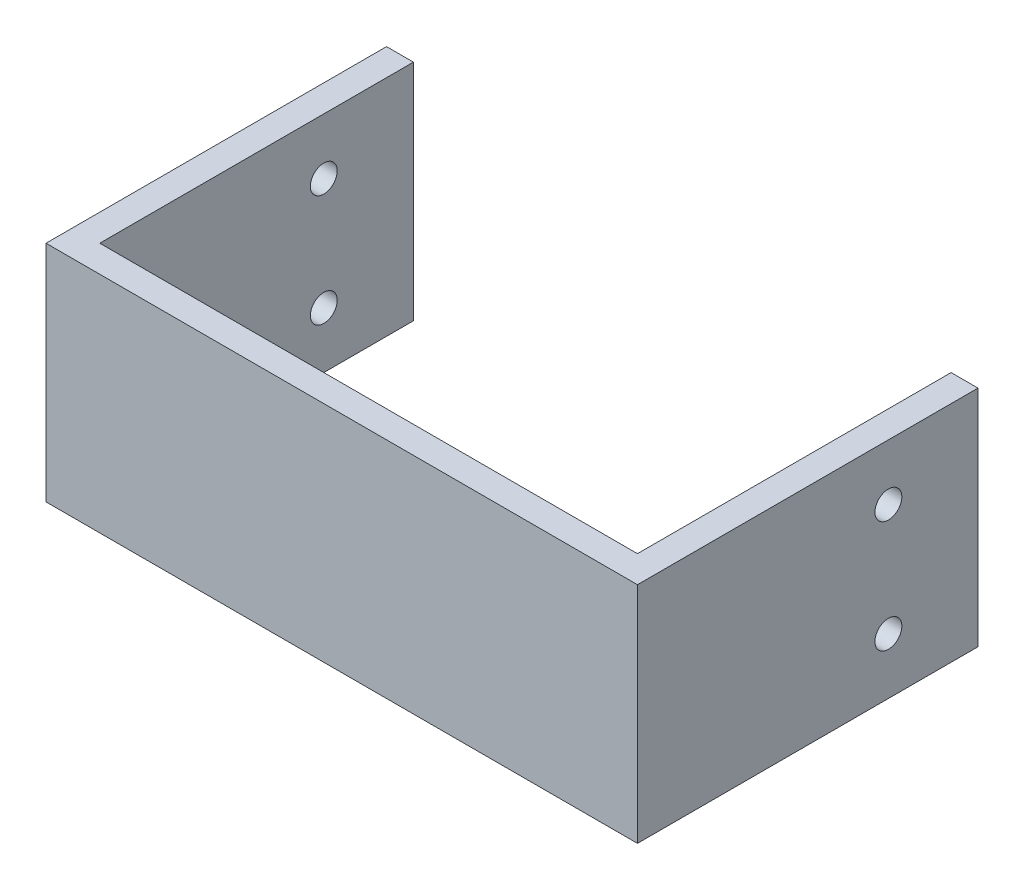
ISO-10303-21;
HEADER;
FILE_DESCRIPTION(('STEP AP214'),'2;1');
FILE_NAME('part.step','',(''),(''),'','','');
FILE_SCHEMA(('AUTOMOTIVE_DESIGN { 1 0 10303 214 1 1 1 1 }'));
ENDSEC;
DATA;
#1=APPLICATION_CONTEXT('core data for automotive mechanical design processes');
#2=APPLICATION_PROTOCOL_DEFINITION('international standard','automotive_design',2000,#1);
#3=PRODUCT_CONTEXT('',#1,'mechanical');
#4=PRODUCT('Part','Part','',(#3));
#5=PRODUCT_RELATED_PRODUCT_CATEGORY('part','',(#4));
#6=PRODUCT_DEFINITION_FORMATION('','',#4);
#7=PRODUCT_DEFINITION_CONTEXT('part definition',#1,'design');
#8=PRODUCT_DEFINITION('design','',#6,#7);
#9=PRODUCT_DEFINITION_SHAPE('','',#8);
#10=(LENGTH_UNIT() NAMED_UNIT(*) SI_UNIT(.MILLI.,.METRE.));
#11=(NAMED_UNIT(*) PLANE_ANGLE_UNIT() SI_UNIT($,.RADIAN.));
#12=(NAMED_UNIT(*) SI_UNIT($,.STERADIAN.) SOLID_ANGLE_UNIT());
#13=UNCERTAINTY_MEASURE_WITH_UNIT(LENGTH_MEASURE(1.E-05),#10,'distance_accuracy_value','');
#14=(GEOMETRIC_REPRESENTATION_CONTEXT(3) GLOBAL_UNCERTAINTY_ASSIGNED_CONTEXT((#13)) GLOBAL_UNIT_ASSIGNED_CONTEXT((#10,
#11,#12)) REPRESENTATION_CONTEXT('',''));
#15=CARTESIAN_POINT('',(0.,0.,0.));
#16=DIRECTION('',(0.,0.,1.));
#17=DIRECTION('',(1.,0.,0.));
#18=AXIS2_PLACEMENT_3D('',#15,#16,#17);
#19=CARTESIAN_POINT('',(0.,0.,0.));
#20=DIRECTION('',(0.,0.,1.));
#21=DIRECTION('',(1.,0.,0.));
#22=AXIS2_PLACEMENT_3D('',#19,#20,#21);
#23=PLANE('',#22);
#24=DIRECTION('',(0.,-1.,0.));
#25=VECTOR('',#24,1.);
#26=CARTESIAN_POINT('',(3.,0.,0.));
#27=LINE('',#26,#25);
#28=CARTESIAN_POINT('',(3.,0.,0.));
#29=VERTEX_POINT('',#28);
#30=CARTESIAN_POINT('',(3.,-25.,0.));
#31=VERTEX_POINT('',#30);
#32=EDGE_CURVE('E111',#29,#31,#27,.T.);
#33=ORIENTED_EDGE('',*,*,#32,.F.);
#34=DIRECTION('',(-1.,0.,0.));
#35=VECTOR('',#34,1.);
#36=CARTESIAN_POINT('',(0.,0.,0.));
#37=LINE('',#36,#35);
#38=CARTESIAN_POINT('',(63.,0.,0.));
#39=VERTEX_POINT('',#38);
#40=EDGE_CURVE('E132',#39,#29,#37,.T.);
#41=ORIENTED_EDGE('',*,*,#40,.F.);
#42=DIRECTION('',(0.,1.,0.));
#43=VECTOR('',#42,1.);
#44=CARTESIAN_POINT('',(63.,0.,0.));
#45=LINE('',#44,#43);
#46=CARTESIAN_POINT('',(63.,-25.,0.));
#47=VERTEX_POINT('',#46);
#48=EDGE_CURVE('E120',#47,#39,#45,.T.);
#49=ORIENTED_EDGE('',*,*,#48,.F.);
#50=DIRECTION('',(1.,0.,0.));
#51=VECTOR('',#50,1.);
#52=CARTESIAN_POINT('',(0.,-25.,0.));
#53=LINE('',#52,#51);
#54=EDGE_CURVE('E59',#31,#47,#53,.T.);
#55=ORIENTED_EDGE('',*,*,#54,.F.);
#56=EDGE_LOOP('',(#33,#41,#49,#55));
#57=FACE_BOUND('',#56,.T.);
#58=ADVANCED_FACE('F41',(#57),#23,.F.);
#59=CARTESIAN_POINT('',(0.,0.,3.));
#60=DIRECTION('',(1.,0.,0.));
#61=DIRECTION('',(0.,1.,0.));
#62=AXIS2_PLACEMENT_3D('',#59,#60,#61);
#63=PLANE('',#62);
#64=CARTESIAN_POINT('',(0.,-6.25,-25.));
#65=DIRECTION('',(-1.,0.,0.));
#66=DIRECTION('',(0.,-1.,0.));
#67=AXIS2_PLACEMENT_3D('',#64,#65,#66);
#68=CIRCLE('',#67,1.5);
#69=CARTESIAN_POINT('',(0.,-7.75,-25.));
#70=VERTEX_POINT('',#69);
#71=EDGE_CURVE('E166',#70,#70,#68,.T.);
#72=ORIENTED_EDGE('',*,*,#71,.F.);
#73=EDGE_LOOP('',(#72));
#74=FACE_BOUND('',#73,.T.);
#75=CARTESIAN_POINT('',(0.,-18.75,-25.));
#76=DIRECTION('',(-1.,0.,0.));
#77=DIRECTION('',(0.,1.,0.));
#78=AXIS2_PLACEMENT_3D('',#75,#76,#77);
#79=CIRCLE('',#78,1.5);
#80=CARTESIAN_POINT('',(0.,-17.25,-25.));
#81=VERTEX_POINT('',#80);
#82=EDGE_CURVE('E173',#81,#81,#79,.T.);
#83=ORIENTED_EDGE('',*,*,#82,.F.);
#84=EDGE_LOOP('',(#83));
#85=FACE_BOUND('',#84,.T.);
#86=DIRECTION('',(0.,0.,-1.));
#87=VECTOR('',#86,1.);
#88=CARTESIAN_POINT('',(0.,0.,3.));
#89=LINE('',#88,#87);
#90=CARTESIAN_POINT('',(0.,0.,3.));
#91=VERTEX_POINT('',#90);
#92=CARTESIAN_POINT('',(0.,0.,-35.));
#93=VERTEX_POINT('',#92);
#94=EDGE_CURVE('E146',#91,#93,#89,.T.);
#95=ORIENTED_EDGE('',*,*,#94,.T.);
#96=DIRECTION('',(0.,1.,0.));
#97=VECTOR('',#96,1.);
#98=CARTESIAN_POINT('',(0.,0.,-35.));
#99=LINE('',#98,#97);
#100=CARTESIAN_POINT('',(0.,-25.,-35.));
#101=VERTEX_POINT('',#100);
#102=EDGE_CURVE('E127',#101,#93,#99,.T.);
#103=ORIENTED_EDGE('',*,*,#102,.F.);
#104=DIRECTION('',(0.,0.,-1.));
#105=VECTOR('',#104,1.);
#106=CARTESIAN_POINT('',(0.,-25.,3.));
#107=LINE('',#106,#105);
#108=CARTESIAN_POINT('',(0.,-25.,3.));
#109=VERTEX_POINT('',#108);
#110=EDGE_CURVE('E11',#109,#101,#107,.T.);
#111=ORIENTED_EDGE('',*,*,#110,.F.);
#112=DIRECTION('',(0.,-1.,0.));
#113=VECTOR('',#112,1.);
#114=CARTESIAN_POINT('',(0.,0.,3.));
#115=LINE('',#114,#113);
#116=EDGE_CURVE('E138',#91,#109,#115,.T.);
#117=ORIENTED_EDGE('',*,*,#116,.F.);
#118=EDGE_LOOP('',(#95,#103,#111,#117));
#119=FACE_BOUND('',#118,.T.);
#120=ADVANCED_FACE('F43',(#74,#85,#119),#63,.F.);
#121=CARTESIAN_POINT('',(0.,-25.,3.));
#122=DIRECTION('',(0.,1.,0.));
#123=DIRECTION('',(0.,0.,1.));
#124=AXIS2_PLACEMENT_3D('',#121,#122,#123);
#125=PLANE('',#124);
#126=ORIENTED_EDGE('',*,*,#110,.T.);
#127=DIRECTION('',(-1.,0.,0.));
#128=VECTOR('',#127,1.);
#129=CARTESIAN_POINT('',(0.,-25.,-35.));
#130=LINE('',#129,#128);
#131=CARTESIAN_POINT('',(3.,-25.,-35.));
#132=VERTEX_POINT('',#131);
#133=EDGE_CURVE('E125',#132,#101,#130,.T.);
#134=ORIENTED_EDGE('',*,*,#133,.F.);
#135=DIRECTION('',(0.,0.,1.));
#136=VECTOR('',#135,1.);
#137=CARTESIAN_POINT('',(3.,-25.,-35.));
#138=LINE('',#137,#136);
#139=EDGE_CURVE('E113',#132,#31,#138,.T.);
#140=ORIENTED_EDGE('',*,*,#139,.T.);
#141=ORIENTED_EDGE('',*,*,#54,.T.);
#142=DIRECTION('',(0.,0.,1.));
#143=VECTOR('',#142,1.);
#144=CARTESIAN_POINT('',(63.,-25.,-35.));
#145=LINE('',#144,#143);
#146=CARTESIAN_POINT('',(63.,-25.,-35.));
#147=VERTEX_POINT('',#146);
#148=EDGE_CURVE('E133',#147,#47,#145,.T.);
#149=ORIENTED_EDGE('',*,*,#148,.F.);
#150=DIRECTION('',(-1.,0.,0.));
#151=VECTOR('',#150,1.);
#152=CARTESIAN_POINT('',(66.,-25.,-35.));
#153=LINE('',#152,#151);
#154=CARTESIAN_POINT('',(66.,-25.,-35.));
#155=VERTEX_POINT('',#154);
#156=EDGE_CURVE('E202',#155,#147,#153,.T.);
#157=ORIENTED_EDGE('',*,*,#156,.F.);
#158=DIRECTION('',(0.,0.,-1.));
#159=VECTOR('',#158,1.);
#160=CARTESIAN_POINT('',(66.,-25.,3.));
#161=LINE('',#160,#159);
#162=CARTESIAN_POINT('',(66.,-25.,3.));
#163=VERTEX_POINT('',#162);
#164=EDGE_CURVE('E51',#163,#155,#161,.T.);
#165=ORIENTED_EDGE('',*,*,#164,.F.);
#166=DIRECTION('',(1.,0.,0.));
#167=VECTOR('',#166,1.);
#168=CARTESIAN_POINT('',(0.,-25.,3.));
#169=LINE('',#168,#167);
#170=EDGE_CURVE('E218',#109,#163,#169,.T.);
#171=ORIENTED_EDGE('',*,*,#170,.F.);
#172=EDGE_LOOP('',(#126,#134,#140,#141,#149,#157,#165,#171));
#173=FACE_BOUND('',#172,.T.);
#174=ADVANCED_FACE('F123',(#173),#125,.F.);
#175=CARTESIAN_POINT('',(66.,0.,3.));
#176=DIRECTION('',(-1.,0.,0.));
#177=DIRECTION('',(0.,0.,1.));
#178=AXIS2_PLACEMENT_3D('',#175,#176,#177);
#179=PLANE('',#178);
#180=CARTESIAN_POINT('',(66.,-6.24999999999999,-25.));
#181=DIRECTION('',(-1.,0.,0.));
#182=DIRECTION('',(0.,-1.,0.));
#183=AXIS2_PLACEMENT_3D('',#180,#181,#182);
#184=CIRCLE('',#183,1.5);
#185=CARTESIAN_POINT('',(66.,-7.74999999999999,-25.));
#186=VERTEX_POINT('',#185);
#187=EDGE_CURVE('E157',#186,#186,#184,.T.);
#188=ORIENTED_EDGE('',*,*,#187,.T.);
#189=EDGE_LOOP('',(#188));
#190=FACE_BOUND('',#189,.T.);
#191=CARTESIAN_POINT('',(66.,-18.75,-25.));
#192=DIRECTION('',(-1.,0.,0.));
#193=DIRECTION('',(0.,1.,0.));
#194=AXIS2_PLACEMENT_3D('',#191,#192,#193);
#195=CIRCLE('',#194,1.5);
#196=CARTESIAN_POINT('',(66.,-17.25,-25.));
#197=VERTEX_POINT('',#196);
#198=EDGE_CURVE('E179',#197,#197,#195,.T.);
#199=ORIENTED_EDGE('',*,*,#198,.T.);
#200=EDGE_LOOP('',(#199));
#201=FACE_BOUND('',#200,.T.);
#202=ORIENTED_EDGE('',*,*,#164,.T.);
#203=DIRECTION('',(0.,-1.,0.));
#204=VECTOR('',#203,1.);
#205=CARTESIAN_POINT('',(66.,0.,-35.));
#206=LINE('',#205,#204);
#207=CARTESIAN_POINT('',(66.,0.,-35.));
#208=VERTEX_POINT('',#207);
#209=EDGE_CURVE('E198',#208,#155,#206,.T.);
#210=ORIENTED_EDGE('',*,*,#209,.F.);
#211=DIRECTION('',(0.,0.,-1.));
#212=VECTOR('',#211,1.);
#213=CARTESIAN_POINT('',(66.,0.,3.));
#214=LINE('',#213,#212);
#215=CARTESIAN_POINT('',(66.,0.,3.));
#216=VERTEX_POINT('',#215);
#217=EDGE_CURVE('E149',#216,#208,#214,.T.);
#218=ORIENTED_EDGE('',*,*,#217,.F.);
#219=DIRECTION('',(0.,1.,0.));
#220=VECTOR('',#219,1.);
#221=CARTESIAN_POINT('',(66.,0.,3.));
#222=LINE('',#221,#220);
#223=EDGE_CURVE('E220',#163,#216,#222,.T.);
#224=ORIENTED_EDGE('',*,*,#223,.F.);
#225=EDGE_LOOP('',(#202,#210,#218,#224));
#226=FACE_BOUND('',#225,.T.);
#227=ADVANCED_FACE('F228',(#190,#201,#226),#179,.F.);
#228=CARTESIAN_POINT('',(0.,0.,3.));
#229=DIRECTION('',(0.,-1.,0.));
#230=DIRECTION('',(0.,0.,-1.));
#231=AXIS2_PLACEMENT_3D('',#228,#229,#230);
#232=PLANE('',#231);
#233=ORIENTED_EDGE('',*,*,#217,.T.);
#234=DIRECTION('',(1.,0.,0.));
#235=VECTOR('',#234,1.);
#236=CARTESIAN_POINT('',(66.,0.,-35.));
#237=LINE('',#236,#235);
#238=CARTESIAN_POINT('',(63.,0.,-35.));
#239=VERTEX_POINT('',#238);
#240=EDGE_CURVE('E207',#239,#208,#237,.T.);
#241=ORIENTED_EDGE('',*,*,#240,.F.);
#242=DIRECTION('',(0.,0.,1.));
#243=VECTOR('',#242,1.);
#244=CARTESIAN_POINT('',(63.,0.,-35.));
#245=LINE('',#244,#243);
#246=EDGE_CURVE('E141',#239,#39,#245,.T.);
#247=ORIENTED_EDGE('',*,*,#246,.T.);
#248=ORIENTED_EDGE('',*,*,#40,.T.);
#249=DIRECTION('',(0.,0.,1.));
#250=VECTOR('',#249,1.);
#251=CARTESIAN_POINT('',(3.,0.,-35.));
#252=LINE('',#251,#250);
#253=CARTESIAN_POINT('',(3.,0.,-35.));
#254=VERTEX_POINT('',#253);
#255=EDGE_CURVE('E116',#254,#29,#252,.T.);
#256=ORIENTED_EDGE('',*,*,#255,.F.);
#257=DIRECTION('',(1.,0.,0.));
#258=VECTOR('',#257,1.);
#259=CARTESIAN_POINT('',(0.,0.,-35.));
#260=LINE('',#259,#258);
#261=EDGE_CURVE('E121',#93,#254,#260,.T.);
#262=ORIENTED_EDGE('',*,*,#261,.F.);
#263=ORIENTED_EDGE('',*,*,#94,.F.);
#264=DIRECTION('',(-1.,0.,0.));
#265=VECTOR('',#264,1.);
#266=CARTESIAN_POINT('',(0.,0.,3.));
#267=LINE('',#266,#265);
#268=EDGE_CURVE('E67',#216,#91,#267,.T.);
#269=ORIENTED_EDGE('',*,*,#268,.F.);
#270=EDGE_LOOP('',(#233,#241,#247,#248,#256,#262,#263,#269));
#271=FACE_BOUND('',#270,.T.);
#272=ADVANCED_FACE('F231',(#271),#232,.F.);
#273=CARTESIAN_POINT('',(0.,0.,3.));
#274=DIRECTION('',(0.,0.,1.));
#275=DIRECTION('',(1.,0.,0.));
#276=AXIS2_PLACEMENT_3D('',#273,#274,#275);
#277=PLANE('',#276);
#278=ORIENTED_EDGE('',*,*,#116,.T.);
#279=ORIENTED_EDGE('',*,*,#170,.T.);
#280=ORIENTED_EDGE('',*,*,#223,.T.);
#281=ORIENTED_EDGE('',*,*,#268,.T.);
#282=EDGE_LOOP('',(#278,#279,#280,#281));
#283=FACE_BOUND('',#282,.T.);
#284=ADVANCED_FACE('F224',(#283),#277,.T.);
#285=CARTESIAN_POINT('',(63.,0.,-35.));
#286=DIRECTION('',(1.,0.,0.));
#287=DIRECTION('',(0.,0.,-1.));
#288=AXIS2_PLACEMENT_3D('',#285,#286,#287);
#289=PLANE('',#288);
#290=CARTESIAN_POINT('',(63.,-6.24999999999999,-25.));
#291=DIRECTION('',(1.,0.,0.));
#292=DIRECTION('',(0.,0.,-1.));
#293=AXIS2_PLACEMENT_3D('',#290,#291,#292);
#294=CIRCLE('',#293,1.5);
#295=CARTESIAN_POINT('',(63.,-6.24999999999999,-26.5));
#296=VERTEX_POINT('',#295);
#297=EDGE_CURVE('E183',#296,#296,#294,.T.);
#298=ORIENTED_EDGE('',*,*,#297,.T.);
#299=EDGE_LOOP('',(#298));
#300=FACE_BOUND('',#299,.T.);
#301=CARTESIAN_POINT('',(63.,-18.75,-25.));
#302=DIRECTION('',(1.,0.,0.));
#303=DIRECTION('',(0.,0.,-1.));
#304=AXIS2_PLACEMENT_3D('',#301,#302,#303);
#305=CIRCLE('',#304,1.5);
#306=CARTESIAN_POINT('',(63.,-18.75,-26.5));
#307=VERTEX_POINT('',#306);
#308=EDGE_CURVE('E156',#307,#307,#305,.T.);
#309=ORIENTED_EDGE('',*,*,#308,.T.);
#310=EDGE_LOOP('',(#309));
#311=FACE_BOUND('',#310,.T.);
#312=ORIENTED_EDGE('',*,*,#48,.T.);
#313=ORIENTED_EDGE('',*,*,#246,.F.);
#314=DIRECTION('',(0.,1.,0.));
#315=VECTOR('',#314,1.);
#316=CARTESIAN_POINT('',(63.,0.,-35.));
#317=LINE('',#316,#315);
#318=EDGE_CURVE('E205',#147,#239,#317,.T.);
#319=ORIENTED_EDGE('',*,*,#318,.F.);
#320=ORIENTED_EDGE('',*,*,#148,.T.);
#321=EDGE_LOOP('',(#312,#313,#319,#320));
#322=FACE_BOUND('',#321,.T.);
#323=ADVANCED_FACE('F241',(#300,#311,#322),#289,.F.);
#324=CARTESIAN_POINT('',(0.,0.,-35.));
#325=DIRECTION('',(0.,0.,-1.));
#326=DIRECTION('',(-1.,0.,0.));
#327=AXIS2_PLACEMENT_3D('',#324,#325,#326);
#328=PLANE('',#327);
#329=ORIENTED_EDGE('',*,*,#209,.T.);
#330=ORIENTED_EDGE('',*,*,#156,.T.);
#331=ORIENTED_EDGE('',*,*,#318,.T.);
#332=ORIENTED_EDGE('',*,*,#240,.T.);
#333=EDGE_LOOP('',(#329,#330,#331,#332));
#334=FACE_BOUND('',#333,.T.);
#335=ADVANCED_FACE('F245',(#334),#328,.T.);
#336=CARTESIAN_POINT('',(3.,0.,-35.));
#337=DIRECTION('',(-1.,0.,0.));
#338=DIRECTION('',(0.,0.,1.));
#339=AXIS2_PLACEMENT_3D('',#336,#337,#338);
#340=PLANE('',#339);
#341=CARTESIAN_POINT('',(3.,-6.25,-25.));
#342=DIRECTION('',(-1.,0.,0.));
#343=DIRECTION('',(0.,0.,1.));
#344=AXIS2_PLACEMENT_3D('',#341,#342,#343);
#345=CIRCLE('',#344,1.5);
#346=CARTESIAN_POINT('',(3.,-6.25,-23.5));
#347=VERTEX_POINT('',#346);
#348=EDGE_CURVE('E45',#347,#347,#345,.T.);
#349=ORIENTED_EDGE('',*,*,#348,.T.);
#350=EDGE_LOOP('',(#349));
#351=FACE_BOUND('',#350,.T.);
#352=CARTESIAN_POINT('',(3.,-18.75,-25.));
#353=DIRECTION('',(-1.,0.,0.));
#354=DIRECTION('',(0.,0.,1.));
#355=AXIS2_PLACEMENT_3D('',#352,#353,#354);
#356=CIRCLE('',#355,1.5);
#357=CARTESIAN_POINT('',(3.,-18.75,-23.5));
#358=VERTEX_POINT('',#357);
#359=EDGE_CURVE('E153',#358,#358,#356,.T.);
#360=ORIENTED_EDGE('',*,*,#359,.T.);
#361=EDGE_LOOP('',(#360));
#362=FACE_BOUND('',#361,.T.);
#363=ORIENTED_EDGE('',*,*,#32,.T.);
#364=ORIENTED_EDGE('',*,*,#139,.F.);
#365=DIRECTION('',(0.,-1.,0.));
#366=VECTOR('',#365,1.);
#367=CARTESIAN_POINT('',(3.,0.,-35.));
#368=LINE('',#367,#366);
#369=EDGE_CURVE('E192',#254,#132,#368,.T.);
#370=ORIENTED_EDGE('',*,*,#369,.F.);
#371=ORIENTED_EDGE('',*,*,#255,.T.);
#372=EDGE_LOOP('',(#363,#364,#370,#371));
#373=FACE_BOUND('',#372,.T.);
#374=ADVANCED_FACE('F112',(#351,#362,#373),#340,.F.);
#375=CARTESIAN_POINT('',(0.,0.,-35.));
#376=DIRECTION('',(0.,0.,-1.));
#377=DIRECTION('',(-1.,0.,0.));
#378=AXIS2_PLACEMENT_3D('',#375,#376,#377);
#379=PLANE('',#378);
#380=ORIENTED_EDGE('',*,*,#261,.T.);
#381=ORIENTED_EDGE('',*,*,#369,.T.);
#382=ORIENTED_EDGE('',*,*,#133,.T.);
#383=ORIENTED_EDGE('',*,*,#102,.T.);
#384=EDGE_LOOP('',(#380,#381,#382,#383));
#385=FACE_BOUND('',#384,.T.);
#386=ADVANCED_FACE('F238',(#385),#379,.T.);
#387=CARTESIAN_POINT('',(66.,-18.75,-25.));
#388=DIRECTION('',(-1.,0.,0.));
#389=DIRECTION('',(0.,-1.,0.));
#390=AXIS2_PLACEMENT_3D('',#387,#388,#389);
#391=CYLINDRICAL_SURFACE('',#390,1.5);
#392=ORIENTED_EDGE('',*,*,#82,.T.);
#393=EDGE_LOOP('',(#392));
#394=FACE_BOUND('',#393,.T.);
#395=ORIENTED_EDGE('',*,*,#359,.F.);
#396=EDGE_LOOP('',(#395));
#397=FACE_BOUND('',#396,.T.);
#398=ADVANCED_FACE('F302',(#394,#397),#391,.F.);
#399=CARTESIAN_POINT('',(66.,-6.24999999999999,-25.));
#400=DIRECTION('',(-1.,0.,0.));
#401=DIRECTION('',(0.,-1.,0.));
#402=AXIS2_PLACEMENT_3D('',#399,#400,#401);
#403=CYLINDRICAL_SURFACE('',#402,1.5);
#404=ORIENTED_EDGE('',*,*,#71,.T.);
#405=EDGE_LOOP('',(#404));
#406=FACE_BOUND('',#405,.T.);
#407=ORIENTED_EDGE('',*,*,#348,.F.);
#408=EDGE_LOOP('',(#407));
#409=FACE_BOUND('',#408,.T.);
#410=ADVANCED_FACE('F309',(#406,#409),#403,.F.);
#411=ORIENTED_EDGE('',*,*,#198,.F.);
#412=EDGE_LOOP('',(#411));
#413=FACE_BOUND('',#412,.T.);
#414=ORIENTED_EDGE('',*,*,#308,.F.);
#415=EDGE_LOOP('',(#414));
#416=FACE_BOUND('',#415,.T.);
#417=ADVANCED_FACE('F312',(#413,#416),#391,.F.);
#418=ORIENTED_EDGE('',*,*,#187,.F.);
#419=EDGE_LOOP('',(#418));
#420=FACE_BOUND('',#419,.T.);
#421=ORIENTED_EDGE('',*,*,#297,.F.);
#422=EDGE_LOOP('',(#421));
#423=FACE_BOUND('',#422,.T.);
#424=ADVANCED_FACE('F321',(#420,#423),#403,.F.);
#425=CLOSED_SHELL('',(#58,#120,#174,#227,#272,#284,#323,#335,#374,#386,#398,#410,#417,#424));
#426=MANIFOLD_SOLID_BREP('B2',#425);
#427=ADVANCED_BREP_SHAPE_REPRESENTATION('',(#18,#426),#14);
#428=SHAPE_DEFINITION_REPRESENTATION(#9,#427);
ENDSEC;
END-ISO-10303-21;
